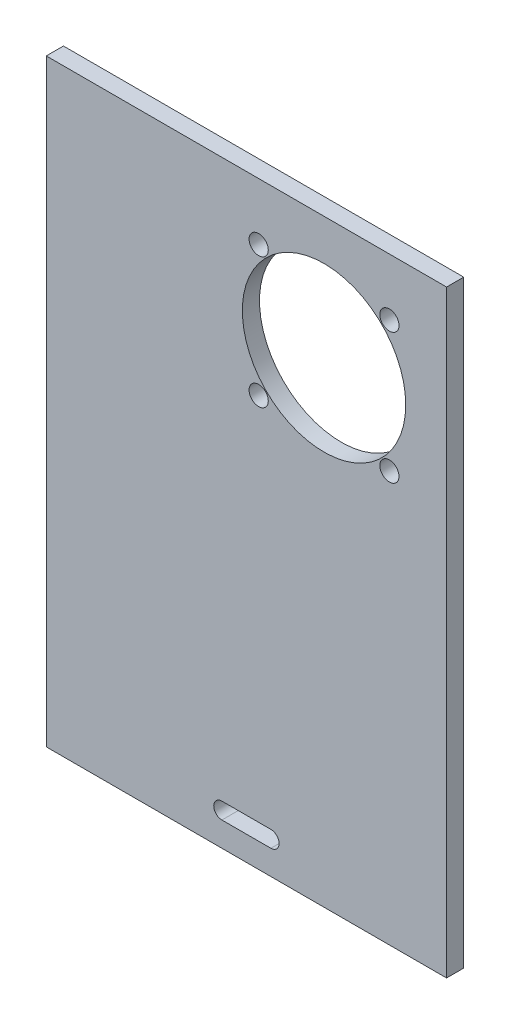
ISO-10303-21;
HEADER;
FILE_DESCRIPTION(('STEP AP214'),'2;1');
FILE_NAME('part.step','',(''),(''),'','','');
FILE_SCHEMA(('AUTOMOTIVE_DESIGN { 1 0 10303 214 1 1 1 1 }'));
ENDSEC;
DATA;
#1=APPLICATION_CONTEXT('core data for automotive mechanical design processes');
#2=APPLICATION_PROTOCOL_DEFINITION('international standard','automotive_design',2000,#1);
#3=PRODUCT_CONTEXT('',#1,'mechanical');
#4=PRODUCT('Part','Part','',(#3));
#5=PRODUCT_RELATED_PRODUCT_CATEGORY('part','',(#4));
#6=PRODUCT_DEFINITION_FORMATION('','',#4);
#7=PRODUCT_DEFINITION_CONTEXT('part definition',#1,'design');
#8=PRODUCT_DEFINITION('design','',#6,#7);
#9=PRODUCT_DEFINITION_SHAPE('','',#8);
#10=(LENGTH_UNIT() NAMED_UNIT(*) SI_UNIT(.MILLI.,.METRE.));
#11=(NAMED_UNIT(*) PLANE_ANGLE_UNIT() SI_UNIT($,.RADIAN.));
#12=(NAMED_UNIT(*) SI_UNIT($,.STERADIAN.) SOLID_ANGLE_UNIT());
#13=UNCERTAINTY_MEASURE_WITH_UNIT(LENGTH_MEASURE(1.E-05),#10,'distance_accuracy_value','');
#14=(GEOMETRIC_REPRESENTATION_CONTEXT(3) GLOBAL_UNCERTAINTY_ASSIGNED_CONTEXT((#13)) GLOBAL_UNIT_ASSIGNED_CONTEXT((#10,
#11,#12)) REPRESENTATION_CONTEXT('',''));
#15=CARTESIAN_POINT('',(0.,0.,0.));
#16=DIRECTION('',(0.,0.,1.));
#17=DIRECTION('',(1.,0.,0.));
#18=AXIS2_PLACEMENT_3D('',#15,#16,#17);
#19=CARTESIAN_POINT('',(-24.7663043478261,39.1467391304348,4.2));
#20=DIRECTION('',(1.,0.,0.));
#21=DIRECTION('',(0.,1.,0.));
#22=AXIS2_PLACEMENT_3D('',#19,#20,#21);
#23=PLANE('',#22);
#24=DIRECTION('',(0.,-1.,0.));
#25=VECTOR('',#24,1.);
#26=CARTESIAN_POINT('',(-24.7663043478261,39.1467391304348,0.));
#27=LINE('',#26,#25);
#28=CARTESIAN_POINT('',(-24.7663043478261,39.1467391304348,0.));
#29=VERTEX_POINT('',#28);
#30=CARTESIAN_POINT('',(-24.7663043478261,-107.353260869565,0.));
#31=VERTEX_POINT('',#30);
#32=EDGE_CURVE('E169',#29,#31,#27,.T.);
#33=ORIENTED_EDGE('',*,*,#32,.T.);
#34=DIRECTION('',(0.,0.,-1.));
#35=VECTOR('',#34,1.);
#36=CARTESIAN_POINT('',(-24.7663043478261,-107.353260869565,4.2));
#37=LINE('',#36,#35);
#38=CARTESIAN_POINT('',(-24.7663043478261,-107.353260869565,4.2));
#39=VERTEX_POINT('',#38);
#40=EDGE_CURVE('E11',#39,#31,#37,.T.);
#41=ORIENTED_EDGE('',*,*,#40,.F.);
#42=DIRECTION('',(0.,-1.,0.));
#43=VECTOR('',#42,1.);
#44=CARTESIAN_POINT('',(-24.7663043478261,39.1467391304348,4.2));
#45=LINE('',#44,#43);
#46=CARTESIAN_POINT('',(-24.7663043478261,39.1467391304348,4.2));
#47=VERTEX_POINT('',#46);
#48=EDGE_CURVE('E158',#47,#39,#45,.T.);
#49=ORIENTED_EDGE('',*,*,#48,.F.);
#50=DIRECTION('',(0.,0.,-1.));
#51=VECTOR('',#50,1.);
#52=CARTESIAN_POINT('',(-24.7663043478261,39.1467391304348,4.2));
#53=LINE('',#52,#51);
#54=EDGE_CURVE('E168',#47,#29,#53,.T.);
#55=ORIENTED_EDGE('',*,*,#54,.T.);
#56=EDGE_LOOP('',(#33,#41,#49,#55));
#57=FACE_BOUND('',#56,.T.);
#58=ADVANCED_FACE('F39',(#57),#23,.F.);
#59=CARTESIAN_POINT('',(-24.7663043478261,-107.353260869565,4.2));
#60=DIRECTION('',(0.,1.,0.));
#61=DIRECTION('',(0.,0.,1.));
#62=AXIS2_PLACEMENT_3D('',#59,#60,#61);
#63=PLANE('',#62);
#64=DIRECTION('',(1.,0.,0.));
#65=VECTOR('',#64,1.);
#66=CARTESIAN_POINT('',(-24.7663043478261,-107.353260869565,0.));
#67=LINE('',#66,#65);
#68=CARTESIAN_POINT('',(73.2336956521739,-107.353260869565,0.));
#69=VERTEX_POINT('',#68);
#70=EDGE_CURVE('E172',#31,#69,#67,.T.);
#71=ORIENTED_EDGE('',*,*,#70,.T.);
#72=DIRECTION('',(0.,0.,-1.));
#73=VECTOR('',#72,1.);
#74=CARTESIAN_POINT('',(73.2336956521739,-107.353260869565,4.2));
#75=LINE('',#74,#73);
#76=CARTESIAN_POINT('',(73.2336956521739,-107.353260869565,4.2));
#77=VERTEX_POINT('',#76);
#78=EDGE_CURVE('E47',#77,#69,#75,.T.);
#79=ORIENTED_EDGE('',*,*,#78,.F.);
#80=DIRECTION('',(1.,0.,0.));
#81=VECTOR('',#80,1.);
#82=CARTESIAN_POINT('',(-24.7663043478261,-107.353260869565,4.2));
#83=LINE('',#82,#81);
#84=EDGE_CURVE('E161',#39,#77,#83,.T.);
#85=ORIENTED_EDGE('',*,*,#84,.F.);
#86=ORIENTED_EDGE('',*,*,#40,.T.);
#87=EDGE_LOOP('',(#71,#79,#85,#86));
#88=FACE_BOUND('',#87,.T.);
#89=ADVANCED_FACE('F213',(#88),#63,.F.);
#90=CARTESIAN_POINT('',(73.2336956521739,39.1467391304348,4.2));
#91=DIRECTION('',(-1.,0.,0.));
#92=DIRECTION('',(0.,-1.,0.));
#93=AXIS2_PLACEMENT_3D('',#90,#91,#92);
#94=PLANE('',#93);
#95=DIRECTION('',(0.,1.,0.));
#96=VECTOR('',#95,1.);
#97=CARTESIAN_POINT('',(73.2336956521739,39.1467391304348,0.));
#98=LINE('',#97,#96);
#99=CARTESIAN_POINT('',(73.2336956521739,39.1467391304348,0.));
#100=VERTEX_POINT('',#99);
#101=EDGE_CURVE('E174',#69,#100,#98,.T.);
#102=ORIENTED_EDGE('',*,*,#101,.T.);
#103=DIRECTION('',(0.,0.,-1.));
#104=VECTOR('',#103,1.);
#105=CARTESIAN_POINT('',(73.2336956521739,39.1467391304348,4.2));
#106=LINE('',#105,#104);
#107=CARTESIAN_POINT('',(73.2336956521739,39.1467391304348,4.2));
#108=VERTEX_POINT('',#107);
#109=EDGE_CURVE('E179',#108,#100,#106,.T.);
#110=ORIENTED_EDGE('',*,*,#109,.F.);
#111=DIRECTION('',(0.,1.,0.));
#112=VECTOR('',#111,1.);
#113=CARTESIAN_POINT('',(73.2336956521739,39.1467391304348,4.2));
#114=LINE('',#113,#112);
#115=EDGE_CURVE('E164',#77,#108,#114,.T.);
#116=ORIENTED_EDGE('',*,*,#115,.F.);
#117=ORIENTED_EDGE('',*,*,#78,.T.);
#118=EDGE_LOOP('',(#102,#110,#116,#117));
#119=FACE_BOUND('',#118,.T.);
#120=ADVANCED_FACE('F218',(#119),#94,.F.);
#121=CARTESIAN_POINT('',(-24.7663043478261,39.1467391304348,4.2));
#122=DIRECTION('',(0.,-1.,0.));
#123=DIRECTION('',(0.,0.,-1.));
#124=AXIS2_PLACEMENT_3D('',#121,#122,#123);
#125=PLANE('',#124);
#126=DIRECTION('',(-1.,0.,0.));
#127=VECTOR('',#126,1.);
#128=CARTESIAN_POINT('',(-24.7663043478261,39.1467391304348,0.));
#129=LINE('',#128,#127);
#130=EDGE_CURVE('E162',#100,#29,#129,.T.);
#131=ORIENTED_EDGE('',*,*,#130,.T.);
#132=ORIENTED_EDGE('',*,*,#54,.F.);
#133=DIRECTION('',(-1.,0.,0.));
#134=VECTOR('',#133,1.);
#135=CARTESIAN_POINT('',(-24.7663043478261,39.1467391304348,4.2));
#136=LINE('',#135,#134);
#137=EDGE_CURVE('E166',#108,#47,#136,.T.);
#138=ORIENTED_EDGE('',*,*,#137,.F.);
#139=ORIENTED_EDGE('',*,*,#109,.T.);
#140=EDGE_LOOP('',(#131,#132,#138,#139));
#141=FACE_BOUND('',#140,.T.);
#142=ADVANCED_FACE('F234',(#141),#125,.F.);
#143=CARTESIAN_POINT('',(0.,0.,4.2));
#144=DIRECTION('',(0.,0.,1.));
#145=DIRECTION('',(1.,0.,0.));
#146=AXIS2_PLACEMENT_3D('',#143,#144,#145);
#147=PLANE('',#146);
#148=CARTESIAN_POINT('',(18.2336956521739,-99.3532608695652,4.2));
#149=DIRECTION('',(0.,0.,1.));
#150=DIRECTION('',(1.,0.,0.));
#151=AXIS2_PLACEMENT_3D('',#148,#149,#150);
#152=CIRCLE('',#151,2.);
#153=CARTESIAN_POINT('',(18.2336956521739,-97.3532608695652,4.2));
#154=VERTEX_POINT('',#153);
#155=CARTESIAN_POINT('',(18.2336956521739,-101.353260869565,4.2));
#156=VERTEX_POINT('',#155);
#157=EDGE_CURVE('E55',#154,#156,#152,.T.);
#158=ORIENTED_EDGE('',*,*,#157,.F.);
#159=DIRECTION('',(-1.,0.,0.));
#160=VECTOR('',#159,1.);
#161=CARTESIAN_POINT('',(18.2336956521739,-97.3532608695652,4.2));
#162=LINE('',#161,#160);
#163=CARTESIAN_POINT('',(30.2336956521739,-97.3532608695652,4.2));
#164=VERTEX_POINT('',#163);
#165=EDGE_CURVE('E123',#164,#154,#162,.T.);
#166=ORIENTED_EDGE('',*,*,#165,.F.);
#167=CARTESIAN_POINT('',(30.2336956521739,-99.3532608695652,4.2));
#168=DIRECTION('',(0.,0.,1.));
#169=DIRECTION('',(1.,0.,0.));
#170=AXIS2_PLACEMENT_3D('',#167,#168,#169);
#171=CIRCLE('',#170,2.);
#172=CARTESIAN_POINT('',(30.2336956521739,-101.353260869565,4.2));
#173=VERTEX_POINT('',#172);
#174=EDGE_CURVE('E126',#173,#164,#171,.T.);
#175=ORIENTED_EDGE('',*,*,#174,.F.);
#176=DIRECTION('',(1.,0.,0.));
#177=VECTOR('',#176,1.);
#178=CARTESIAN_POINT('',(18.2336956521739,-101.353260869565,4.2));
#179=LINE('',#178,#177);
#180=EDGE_CURVE('E132',#156,#173,#179,.T.);
#181=ORIENTED_EDGE('',*,*,#180,.F.);
#182=EDGE_LOOP('',(#158,#166,#175,#181));
#183=FACE_BOUND('',#182,.T.);
#184=CARTESIAN_POINT('',(27.2336956521739,-6.85326086956523,4.2));
#185=DIRECTION('',(0.,0.,1.));
#186=DIRECTION('',(1.,0.,0.));
#187=AXIS2_PLACEMENT_3D('',#184,#185,#186);
#188=CIRCLE('',#187,2.35);
#189=CARTESIAN_POINT('',(29.5836956521739,-6.85326086956523,4.2));
#190=VERTEX_POINT('',#189);
#191=EDGE_CURVE('E138',#190,#190,#188,.T.);
#192=ORIENTED_EDGE('',*,*,#191,.F.);
#193=EDGE_LOOP('',(#192));
#194=FACE_BOUND('',#193,.T.);
#195=CARTESIAN_POINT('',(59.2336956521739,-6.85326086956523,4.2));
#196=DIRECTION('',(0.,0.,1.));
#197=DIRECTION('',(1.,0.,0.));
#198=AXIS2_PLACEMENT_3D('',#195,#196,#197);
#199=CIRCLE('',#198,2.35);
#200=CARTESIAN_POINT('',(61.5836956521739,-6.85326086956523,4.2));
#201=VERTEX_POINT('',#200);
#202=EDGE_CURVE('E146',#201,#201,#199,.T.);
#203=ORIENTED_EDGE('',*,*,#202,.F.);
#204=EDGE_LOOP('',(#203));
#205=FACE_BOUND('',#204,.T.);
#206=CARTESIAN_POINT('',(59.2336956521739,25.1467391304348,4.2));
#207=DIRECTION('',(0.,0.,1.));
#208=DIRECTION('',(1.,0.,0.));
#209=AXIS2_PLACEMENT_3D('',#206,#207,#208);
#210=CIRCLE('',#209,2.35);
#211=CARTESIAN_POINT('',(61.5836956521739,25.1467391304348,4.2));
#212=VERTEX_POINT('',#211);
#213=EDGE_CURVE('E142',#212,#212,#210,.T.);
#214=ORIENTED_EDGE('',*,*,#213,.F.);
#215=EDGE_LOOP('',(#214));
#216=FACE_BOUND('',#215,.T.);
#217=CARTESIAN_POINT('',(27.2336956521739,25.1467391304348,4.2));
#218=DIRECTION('',(0.,0.,1.));
#219=DIRECTION('',(1.,0.,0.));
#220=AXIS2_PLACEMENT_3D('',#217,#218,#219);
#221=CIRCLE('',#220,2.35);
#222=CARTESIAN_POINT('',(29.5836956521739,25.1467391304348,4.2));
#223=VERTEX_POINT('',#222);
#224=EDGE_CURVE('E145',#223,#223,#221,.T.);
#225=ORIENTED_EDGE('',*,*,#224,.F.);
#226=EDGE_LOOP('',(#225));
#227=FACE_BOUND('',#226,.T.);
#228=CARTESIAN_POINT('',(43.2336956521739,9.14673913043477,4.2));
#229=DIRECTION('',(0.,0.,1.));
#230=DIRECTION('',(1.,0.,0.));
#231=AXIS2_PLACEMENT_3D('',#228,#229,#230);
#232=CIRCLE('',#231,20.);
#233=CARTESIAN_POINT('',(63.2336956521739,9.14673913043477,4.2));
#234=VERTEX_POINT('',#233);
#235=EDGE_CURVE('E154',#234,#234,#232,.T.);
#236=ORIENTED_EDGE('',*,*,#235,.F.);
#237=EDGE_LOOP('',(#236));
#238=FACE_BOUND('',#237,.T.);
#239=ORIENTED_EDGE('',*,*,#48,.T.);
#240=ORIENTED_EDGE('',*,*,#84,.T.);
#241=ORIENTED_EDGE('',*,*,#115,.T.);
#242=ORIENTED_EDGE('',*,*,#137,.T.);
#243=EDGE_LOOP('',(#239,#240,#241,#242));
#244=FACE_BOUND('',#243,.T.);
#245=ADVANCED_FACE('F230',(#183,#194,#205,#216,#227,#238,#244),#147,.T.);
#246=CARTESIAN_POINT('',(0.,0.,0.));
#247=DIRECTION('',(0.,0.,1.));
#248=DIRECTION('',(1.,0.,0.));
#249=AXIS2_PLACEMENT_3D('',#246,#247,#248);
#250=PLANE('',#249);
#251=DIRECTION('',(-1.,0.,0.));
#252=VECTOR('',#251,1.);
#253=CARTESIAN_POINT('',(18.2336956521739,-97.3532608695652,0.));
#254=LINE('',#253,#252);
#255=CARTESIAN_POINT('',(30.2336956521739,-97.3532608695652,0.));
#256=VERTEX_POINT('',#255);
#257=CARTESIAN_POINT('',(18.2336956521739,-97.3532608695652,0.));
#258=VERTEX_POINT('',#257);
#259=EDGE_CURVE('E113',#256,#258,#254,.T.);
#260=ORIENTED_EDGE('',*,*,#259,.T.);
#261=CARTESIAN_POINT('',(18.2336956521739,-99.3532608695652,0.));
#262=DIRECTION('',(0.,0.,1.));
#263=DIRECTION('',(1.,0.,0.));
#264=AXIS2_PLACEMENT_3D('',#261,#262,#263);
#265=CIRCLE('',#264,2.);
#266=CARTESIAN_POINT('',(18.2336956521739,-101.353260869565,0.));
#267=VERTEX_POINT('',#266);
#268=EDGE_CURVE('E107',#258,#267,#265,.T.);
#269=ORIENTED_EDGE('',*,*,#268,.T.);
#270=DIRECTION('',(1.,0.,0.));
#271=VECTOR('',#270,1.);
#272=CARTESIAN_POINT('',(18.2336956521739,-101.353260869565,0.));
#273=LINE('',#272,#271);
#274=CARTESIAN_POINT('',(30.2336956521739,-101.353260869565,0.));
#275=VERTEX_POINT('',#274);
#276=EDGE_CURVE('E116',#267,#275,#273,.T.);
#277=ORIENTED_EDGE('',*,*,#276,.T.);
#278=CARTESIAN_POINT('',(30.2336956521739,-99.3532608695652,0.));
#279=DIRECTION('',(0.,0.,1.));
#280=DIRECTION('',(1.,0.,0.));
#281=AXIS2_PLACEMENT_3D('',#278,#279,#280);
#282=CIRCLE('',#281,2.);
#283=EDGE_CURVE('E63',#275,#256,#282,.T.);
#284=ORIENTED_EDGE('',*,*,#283,.T.);
#285=EDGE_LOOP('',(#260,#269,#277,#284));
#286=FACE_BOUND('',#285,.T.);
#287=CARTESIAN_POINT('',(27.2336956521739,-6.85326086956523,0.));
#288=DIRECTION('',(0.,0.,1.));
#289=DIRECTION('',(1.,0.,0.));
#290=AXIS2_PLACEMENT_3D('',#287,#288,#289);
#291=CIRCLE('',#290,2.35);
#292=CARTESIAN_POINT('',(29.5836956521739,-6.85326086956523,0.));
#293=VERTEX_POINT('',#292);
#294=EDGE_CURVE('E42',#293,#293,#291,.T.);
#295=ORIENTED_EDGE('',*,*,#294,.T.);
#296=EDGE_LOOP('',(#295));
#297=FACE_BOUND('',#296,.T.);
#298=CARTESIAN_POINT('',(59.2336956521739,-6.85326086956523,0.));
#299=DIRECTION('',(0.,0.,1.));
#300=DIRECTION('',(1.,0.,0.));
#301=AXIS2_PLACEMENT_3D('',#298,#299,#300);
#302=CIRCLE('',#301,2.35);
#303=CARTESIAN_POINT('',(61.5836956521739,-6.85326086956523,0.));
#304=VERTEX_POINT('',#303);
#305=EDGE_CURVE('E190',#304,#304,#302,.T.);
#306=ORIENTED_EDGE('',*,*,#305,.T.);
#307=EDGE_LOOP('',(#306));
#308=FACE_BOUND('',#307,.T.);
#309=CARTESIAN_POINT('',(59.2336956521739,25.1467391304348,0.));
#310=DIRECTION('',(0.,0.,1.));
#311=DIRECTION('',(1.,0.,0.));
#312=AXIS2_PLACEMENT_3D('',#309,#310,#311);
#313=CIRCLE('',#312,2.35);
#314=CARTESIAN_POINT('',(61.5836956521739,25.1467391304348,0.));
#315=VERTEX_POINT('',#314);
#316=EDGE_CURVE('E188',#315,#315,#313,.T.);
#317=ORIENTED_EDGE('',*,*,#316,.T.);
#318=EDGE_LOOP('',(#317));
#319=FACE_BOUND('',#318,.T.);
#320=CARTESIAN_POINT('',(27.2336956521739,25.1467391304348,0.));
#321=DIRECTION('',(0.,0.,1.));
#322=DIRECTION('',(1.,0.,0.));
#323=AXIS2_PLACEMENT_3D('',#320,#321,#322);
#324=CIRCLE('',#323,2.35);
#325=CARTESIAN_POINT('',(29.5836956521739,25.1467391304348,0.));
#326=VERTEX_POINT('',#325);
#327=EDGE_CURVE('E153',#326,#326,#324,.T.);
#328=ORIENTED_EDGE('',*,*,#327,.T.);
#329=EDGE_LOOP('',(#328));
#330=FACE_BOUND('',#329,.T.);
#331=CARTESIAN_POINT('',(43.2336956521739,9.14673913043477,0.));
#332=DIRECTION('',(0.,0.,1.));
#333=DIRECTION('',(1.,0.,0.));
#334=AXIS2_PLACEMENT_3D('',#331,#332,#333);
#335=CIRCLE('',#334,20.);
#336=CARTESIAN_POINT('',(63.2336956521739,9.14673913043477,0.));
#337=VERTEX_POINT('',#336);
#338=EDGE_CURVE('E157',#337,#337,#335,.T.);
#339=ORIENTED_EDGE('',*,*,#338,.T.);
#340=EDGE_LOOP('',(#339));
#341=FACE_BOUND('',#340,.T.);
#342=ORIENTED_EDGE('',*,*,#32,.F.);
#343=ORIENTED_EDGE('',*,*,#130,.F.);
#344=ORIENTED_EDGE('',*,*,#101,.F.);
#345=ORIENTED_EDGE('',*,*,#70,.F.);
#346=EDGE_LOOP('',(#342,#343,#344,#345));
#347=FACE_BOUND('',#346,.T.);
#348=ADVANCED_FACE('F120',(#286,#297,#308,#319,#330,#341,#347),#250,.F.);
#349=CARTESIAN_POINT('',(43.2336956521739,9.14673913043477,-5.8));
#350=DIRECTION('',(0.,0.,1.));
#351=DIRECTION('',(1.,0.,0.));
#352=AXIS2_PLACEMENT_3D('',#349,#350,#351);
#353=CYLINDRICAL_SURFACE('',#352,20.);
#354=ORIENTED_EDGE('',*,*,#235,.T.);
#355=EDGE_LOOP('',(#354));
#356=FACE_BOUND('',#355,.T.);
#357=ORIENTED_EDGE('',*,*,#338,.F.);
#358=EDGE_LOOP('',(#357));
#359=FACE_BOUND('',#358,.T.);
#360=ADVANCED_FACE('F245',(#356,#359),#353,.F.);
#361=CARTESIAN_POINT('',(27.2336956521739,25.1467391304348,-5.8));
#362=DIRECTION('',(0.,0.,1.));
#363=DIRECTION('',(1.,0.,0.));
#364=AXIS2_PLACEMENT_3D('',#361,#362,#363);
#365=CYLINDRICAL_SURFACE('',#364,2.35);
#366=ORIENTED_EDGE('',*,*,#224,.T.);
#367=EDGE_LOOP('',(#366));
#368=FACE_BOUND('',#367,.T.);
#369=ORIENTED_EDGE('',*,*,#327,.F.);
#370=EDGE_LOOP('',(#369));
#371=FACE_BOUND('',#370,.T.);
#372=ADVANCED_FACE('F250',(#368,#371),#365,.F.);
#373=CARTESIAN_POINT('',(59.2336956521739,25.1467391304348,-5.8));
#374=DIRECTION('',(0.,0.,1.));
#375=DIRECTION('',(1.,0.,0.));
#376=AXIS2_PLACEMENT_3D('',#373,#374,#375);
#377=CYLINDRICAL_SURFACE('',#376,2.35);
#378=ORIENTED_EDGE('',*,*,#213,.T.);
#379=EDGE_LOOP('',(#378));
#380=FACE_BOUND('',#379,.T.);
#381=ORIENTED_EDGE('',*,*,#316,.F.);
#382=EDGE_LOOP('',(#381));
#383=FACE_BOUND('',#382,.T.);
#384=ADVANCED_FACE('F208',(#380,#383),#377,.F.);
#385=CARTESIAN_POINT('',(59.2336956521739,-6.85326086956523,-5.8));
#386=DIRECTION('',(0.,0.,1.));
#387=DIRECTION('',(1.,0.,0.));
#388=AXIS2_PLACEMENT_3D('',#385,#386,#387);
#389=CYLINDRICAL_SURFACE('',#388,2.35);
#390=ORIENTED_EDGE('',*,*,#202,.T.);
#391=EDGE_LOOP('',(#390));
#392=FACE_BOUND('',#391,.T.);
#393=ORIENTED_EDGE('',*,*,#305,.F.);
#394=EDGE_LOOP('',(#393));
#395=FACE_BOUND('',#394,.T.);
#396=ADVANCED_FACE('F199',(#392,#395),#389,.F.);
#397=CARTESIAN_POINT('',(27.2336956521739,-6.85326086956523,-5.8));
#398=DIRECTION('',(0.,0.,1.));
#399=DIRECTION('',(1.,0.,0.));
#400=AXIS2_PLACEMENT_3D('',#397,#398,#399);
#401=CYLINDRICAL_SURFACE('',#400,2.35);
#402=ORIENTED_EDGE('',*,*,#191,.T.);
#403=EDGE_LOOP('',(#402));
#404=FACE_BOUND('',#403,.T.);
#405=ORIENTED_EDGE('',*,*,#294,.F.);
#406=EDGE_LOOP('',(#405));
#407=FACE_BOUND('',#406,.T.);
#408=ADVANCED_FACE('F197',(#404,#407),#401,.F.);
#409=CARTESIAN_POINT('',(18.2336956521739,-99.3532608695652,0.));
#410=DIRECTION('',(0.,0.,1.));
#411=DIRECTION('',(1.,0.,0.));
#412=AXIS2_PLACEMENT_3D('',#409,#410,#411);
#413=CYLINDRICAL_SURFACE('',#412,2.);
#414=ORIENTED_EDGE('',*,*,#157,.T.);
#415=DIRECTION('',(0.,0.,1.));
#416=VECTOR('',#415,1.);
#417=CARTESIAN_POINT('',(18.2336956521739,-101.353260869565,0.));
#418=LINE('',#417,#416);
#419=EDGE_CURVE('E103',#267,#156,#418,.T.);
#420=ORIENTED_EDGE('',*,*,#419,.F.);
#421=ORIENTED_EDGE('',*,*,#268,.F.);
#422=DIRECTION('',(0.,0.,1.));
#423=VECTOR('',#422,1.);
#424=CARTESIAN_POINT('',(18.2336956521739,-97.3532608695652,0.));
#425=LINE('',#424,#423);
#426=EDGE_CURVE('E136',#258,#154,#425,.T.);
#427=ORIENTED_EDGE('',*,*,#426,.T.);
#428=EDGE_LOOP('',(#414,#420,#421,#427));
#429=FACE_BOUND('',#428,.T.);
#430=ADVANCED_FACE('F105',(#429),#413,.F.);
#431=CARTESIAN_POINT('',(18.2336956521739,-97.3532608695652,0.));
#432=DIRECTION('',(0.,1.,0.));
#433=DIRECTION('',(0.,0.,1.));
#434=AXIS2_PLACEMENT_3D('',#431,#432,#433);
#435=PLANE('',#434);
#436=ORIENTED_EDGE('',*,*,#165,.T.);
#437=ORIENTED_EDGE('',*,*,#426,.F.);
#438=ORIENTED_EDGE('',*,*,#259,.F.);
#439=DIRECTION('',(0.,0.,1.));
#440=VECTOR('',#439,1.);
#441=CARTESIAN_POINT('',(30.2336956521739,-97.3532608695652,0.));
#442=LINE('',#441,#440);
#443=EDGE_CURVE('E139',#256,#164,#442,.T.);
#444=ORIENTED_EDGE('',*,*,#443,.T.);
#445=EDGE_LOOP('',(#436,#437,#438,#444));
#446=FACE_BOUND('',#445,.T.);
#447=ADVANCED_FACE('F206',(#446),#435,.F.);
#448=CARTESIAN_POINT('',(30.2336956521739,-99.3532608695652,0.));
#449=DIRECTION('',(0.,0.,1.));
#450=DIRECTION('',(1.,0.,0.));
#451=AXIS2_PLACEMENT_3D('',#448,#449,#450);
#452=CYLINDRICAL_SURFACE('',#451,2.);
#453=ORIENTED_EDGE('',*,*,#174,.T.);
#454=ORIENTED_EDGE('',*,*,#443,.F.);
#455=ORIENTED_EDGE('',*,*,#283,.F.);
#456=DIRECTION('',(0.,0.,1.));
#457=VECTOR('',#456,1.);
#458=CARTESIAN_POINT('',(30.2336956521739,-101.353260869565,0.));
#459=LINE('',#458,#457);
#460=EDGE_CURVE('E112',#275,#173,#459,.T.);
#461=ORIENTED_EDGE('',*,*,#460,.T.);
#462=EDGE_LOOP('',(#453,#454,#455,#461));
#463=FACE_BOUND('',#462,.T.);
#464=ADVANCED_FACE('F275',(#463),#452,.F.);
#465=CARTESIAN_POINT('',(18.2336956521739,-101.353260869565,0.));
#466=DIRECTION('',(0.,-1.,0.));
#467=DIRECTION('',(0.,0.,-1.));
#468=AXIS2_PLACEMENT_3D('',#465,#466,#467);
#469=PLANE('',#468);
#470=ORIENTED_EDGE('',*,*,#180,.T.);
#471=ORIENTED_EDGE('',*,*,#460,.F.);
#472=ORIENTED_EDGE('',*,*,#276,.F.);
#473=ORIENTED_EDGE('',*,*,#419,.T.);
#474=EDGE_LOOP('',(#470,#471,#472,#473));
#475=FACE_BOUND('',#474,.T.);
#476=ADVANCED_FACE('F117',(#475),#469,.F.);
#477=CLOSED_SHELL('',(#58,#89,#120,#142,#245,#348,#360,#372,#384,#396,#408,#430,#447,#464,#476));
#478=MANIFOLD_SOLID_BREP('B2',#477);
#479=ADVANCED_BREP_SHAPE_REPRESENTATION('',(#18,#478),#14);
#480=SHAPE_DEFINITION_REPRESENTATION(#9,#479);
ENDSEC;
END-ISO-10303-21;
